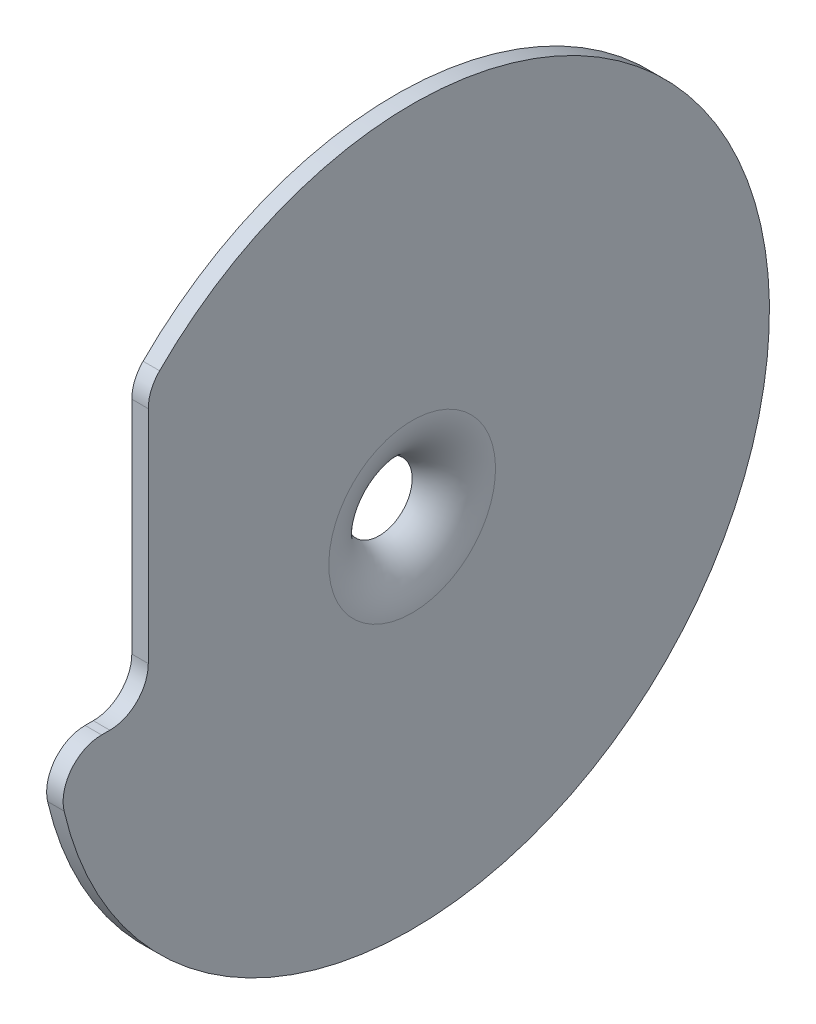
ISO-10303-21;
HEADER;
FILE_DESCRIPTION(('STEP AP214'),'2;1');
FILE_NAME('part.step','',(''),(''),'','','');
FILE_SCHEMA(('AUTOMOTIVE_DESIGN { 1 0 10303 214 1 1 1 1 }'));
ENDSEC;
DATA;
#1=APPLICATION_CONTEXT('core data for automotive mechanical design processes');
#2=APPLICATION_PROTOCOL_DEFINITION('international standard','automotive_design',2000,#1);
#3=PRODUCT_CONTEXT('',#1,'mechanical');
#4=PRODUCT('Part','Part','',(#3));
#5=PRODUCT_RELATED_PRODUCT_CATEGORY('part','',(#4));
#6=PRODUCT_DEFINITION_FORMATION('','',#4);
#7=PRODUCT_DEFINITION_CONTEXT('part definition',#1,'design');
#8=PRODUCT_DEFINITION('design','',#6,#7);
#9=PRODUCT_DEFINITION_SHAPE('','',#8);
#10=(LENGTH_UNIT() NAMED_UNIT(*) SI_UNIT(.MILLI.,.METRE.));
#11=(NAMED_UNIT(*) PLANE_ANGLE_UNIT() SI_UNIT($,.RADIAN.));
#12=(NAMED_UNIT(*) SI_UNIT($,.STERADIAN.) SOLID_ANGLE_UNIT());
#13=UNCERTAINTY_MEASURE_WITH_UNIT(LENGTH_MEASURE(1.E-05),#10,'distance_accuracy_value','');
#14=(GEOMETRIC_REPRESENTATION_CONTEXT(3) GLOBAL_UNCERTAINTY_ASSIGNED_CONTEXT((#13)) GLOBAL_UNIT_ASSIGNED_CONTEXT((#10,
#11,#12)) REPRESENTATION_CONTEXT('',''));
#15=CARTESIAN_POINT('',(0.,0.,0.));
#16=DIRECTION('',(0.,0.,1.));
#17=DIRECTION('',(1.,0.,0.));
#18=AXIS2_PLACEMENT_3D('',#15,#16,#17);
#19=CARTESIAN_POINT('',(-22.,0.,-2.));
#20=DIRECTION('',(0.,0.,1.));
#21=DIRECTION('',(0.,-1.,0.));
#22=AXIS2_PLACEMENT_3D('',#19,#20,#21);
#23=PLANE('',#22);
#24=DIRECTION('',(0.,-1.,0.));
#25=VECTOR('',#24,1.);
#26=CARTESIAN_POINT('',(-19.,0.,-2.));
#27=LINE('',#26,#25);
#28=CARTESIAN_POINT('',(-19.,22.6516557208048,-2.));
#29=VERTEX_POINT('',#28);
#30=CARTESIAN_POINT('',(-19.,-17.5,-2.));
#31=VERTEX_POINT('',#30);
#32=EDGE_CURVE('E115',#29,#31,#27,.T.);
#33=ORIENTED_EDGE('',*,*,#32,.F.);
#34=DIRECTION('',(-1.,0.,0.));
#35=VECTOR('',#34,1.);
#36=CARTESIAN_POINT('',(-22.,22.6516557208048,-2.));
#37=LINE('',#36,#35);
#38=CARTESIAN_POINT('',(-22.,22.6516557208048,-2.));
#39=VERTEX_POINT('',#38);
#40=EDGE_CURVE('E95',#29,#39,#37,.T.);
#41=ORIENTED_EDGE('',*,*,#40,.T.);
#42=DIRECTION('',(0.,-1.,0.));
#43=VECTOR('',#42,1.);
#44=CARTESIAN_POINT('',(-22.,0.,-2.));
#45=LINE('',#44,#43);
#46=CARTESIAN_POINT('',(-22.,-17.5,-2.));
#47=VERTEX_POINT('',#46);
#48=EDGE_CURVE('E117',#39,#47,#45,.T.);
#49=ORIENTED_EDGE('',*,*,#48,.T.);
#50=DIRECTION('',(1.,0.,0.));
#51=VECTOR('',#50,1.);
#52=CARTESIAN_POINT('',(-19.,-17.5,-2.));
#53=LINE('',#52,#51);
#54=EDGE_CURVE('E100',#47,#31,#53,.T.);
#55=ORIENTED_EDGE('',*,*,#54,.T.);
#56=EDGE_LOOP('',(#33,#41,#49,#55));
#57=FACE_BOUND('',#56,.T.);
#58=ADVANCED_FACE('F35',(#57),#23,.T.);
#59=CARTESIAN_POINT('',(-22.,-18.3727272727272,-50.));
#60=DIRECTION('',(1.,0.,0.));
#61=DIRECTION('',(0.,1.,0.));
#62=AXIS2_PLACEMENT_3D('',#59,#60,#61);
#63=CYLINDRICAL_SURFACE('',#62,65.);
#64=CARTESIAN_POINT('',(-22.,-18.3727272727272,-50.));
#65=DIRECTION('',(-1.,0.,0.));
#66=DIRECTION('',(0.,-1.,0.));
#67=AXIS2_PLACEMENT_3D('',#64,#65,#66);
#68=CIRCLE('',#67,65.);
#69=CARTESIAN_POINT('',(-22.,27.6028743579553,-4.05172413793104));
#70=VERTEX_POINT('',#69);
#71=CARTESIAN_POINT('',(-22.,-33.0843260188088,13.3132597670843));
#72=VERTEX_POINT('',#71);
#73=EDGE_CURVE('E109',#70,#72,#68,.T.);
#74=ORIENTED_EDGE('',*,*,#73,.F.);
#75=DIRECTION('',(1.,0.,0.));
#76=VECTOR('',#75,1.);
#77=CARTESIAN_POINT('',(-22.,27.6028743579553,-4.05172413793104));
#78=LINE('',#77,#76);
#79=CARTESIAN_POINT('',(-19.,27.6028743579553,-4.05172413793104));
#80=VERTEX_POINT('',#79);
#81=EDGE_CURVE('E94',#70,#80,#78,.T.);
#82=ORIENTED_EDGE('',*,*,#81,.T.);
#83=CARTESIAN_POINT('',(-19.,-18.3727272727272,-50.));
#84=DIRECTION('',(-1.,0.,0.));
#85=DIRECTION('',(0.,-1.,0.));
#86=AXIS2_PLACEMENT_3D('',#83,#84,#85);
#87=CIRCLE('',#86,65.);
#88=CARTESIAN_POINT('',(-19.,-33.0843260188088,13.3132597670843));
#89=VERTEX_POINT('',#88);
#90=EDGE_CURVE('E107',#80,#89,#87,.T.);
#91=ORIENTED_EDGE('',*,*,#90,.T.);
#92=DIRECTION('',(1.,0.,0.));
#93=VECTOR('',#92,1.);
#94=CARTESIAN_POINT('',(-22.,-33.0843260188088,13.3132597670843));
#95=LINE('',#94,#93);
#96=EDGE_CURVE('E110',#89,#72,#95,.F.);
#97=ORIENTED_EDGE('',*,*,#96,.T.);
#98=EDGE_LOOP('',(#74,#82,#91,#97));
#99=FACE_BOUND('',#98,.T.);
#100=ADVANCED_FACE('F106',(#99),#63,.T.);
#101=CARTESIAN_POINT('',(-22.,-24.5,0.));
#102=DIRECTION('',(0.,1.,0.));
#103=DIRECTION('',(-1.,0.,0.));
#104=AXIS2_PLACEMENT_3D('',#101,#102,#103);
#105=PLANE('',#104);
#106=DIRECTION('',(0.,0.,1.));
#107=VECTOR('',#106,1.);
#108=CARTESIAN_POINT('',(-22.,-24.5,0.));
#109=LINE('',#108,#107);
#110=CARTESIAN_POINT('',(-22.,-24.5,5.));
#111=VERTEX_POINT('',#110);
#112=CARTESIAN_POINT('',(-22.,-24.5,6.49490871524444));
#113=VERTEX_POINT('',#112);
#114=EDGE_CURVE('E123',#111,#113,#109,.T.);
#115=ORIENTED_EDGE('',*,*,#114,.T.);
#116=DIRECTION('',(-1.,0.,0.));
#117=VECTOR('',#116,1.);
#118=CARTESIAN_POINT('',(-19.,-24.5,6.49490871524444));
#119=LINE('',#118,#117);
#120=CARTESIAN_POINT('',(-19.,-24.5,6.49490871524444));
#121=VERTEX_POINT('',#120);
#122=EDGE_CURVE('E133',#113,#121,#119,.F.);
#123=ORIENTED_EDGE('',*,*,#122,.T.);
#124=DIRECTION('',(0.,0.,1.));
#125=VECTOR('',#124,1.);
#126=CARTESIAN_POINT('',(-19.,-24.5,0.));
#127=LINE('',#126,#125);
#128=CARTESIAN_POINT('',(-19.,-24.5,5.));
#129=VERTEX_POINT('',#128);
#130=EDGE_CURVE('E114',#129,#121,#127,.T.);
#131=ORIENTED_EDGE('',*,*,#130,.F.);
#132=DIRECTION('',(1.,0.,0.));
#133=VECTOR('',#132,1.);
#134=CARTESIAN_POINT('',(-22.,-24.5,5.));
#135=LINE('',#134,#133);
#136=EDGE_CURVE('E57',#129,#111,#135,.F.);
#137=ORIENTED_EDGE('',*,*,#136,.T.);
#138=EDGE_LOOP('',(#115,#123,#131,#137));
#139=FACE_BOUND('',#138,.T.);
#140=ADVANCED_FACE('F150',(#139),#105,.T.);
#141=CARTESIAN_POINT('',(-22.,0.,0.));
#142=DIRECTION('',(-1.,0.,0.));
#143=DIRECTION('',(0.,-1.,0.));
#144=AXIS2_PLACEMENT_3D('',#141,#142,#143);
#145=PLANE('',#144);
#146=CARTESIAN_POINT('',(-22.,-18.3727272727272,-50.));
#147=DIRECTION('',(-1.,0.,0.));
#148=DIRECTION('',(0.,-1.,0.));
#149=AXIS2_PLACEMENT_3D('',#146,#147,#148);
#150=CIRCLE('',#149,31.5);
#151=CARTESIAN_POINT('',(-22.,-49.8727272727272,-50.));
#152=VERTEX_POINT('',#151);
#153=EDGE_CURVE('E43',#152,#152,#150,.T.);
#154=ORIENTED_EDGE('',*,*,#153,.F.);
#155=EDGE_LOOP('',(#154));
#156=FACE_BOUND('',#155,.T.);
#157=ORIENTED_EDGE('',*,*,#48,.F.);
#158=CARTESIAN_POINT('',(-22.,22.6516557208048,-9.));
#159=DIRECTION('',(-1.,0.,0.));
#160=DIRECTION('',(0.,-1.,0.));
#161=AXIS2_PLACEMENT_3D('',#158,#159,#160);
#162=CIRCLE('',#161,7.);
#163=EDGE_CURVE('E130',#39,#70,#162,.T.);
#164=ORIENTED_EDGE('',*,*,#163,.T.);
#165=ORIENTED_EDGE('',*,*,#73,.T.);
#166=CARTESIAN_POINT('',(-22.,-31.5,6.49490871524444));
#167=DIRECTION('',(-1.,0.,0.));
#168=DIRECTION('',(0.,-1.,0.));
#169=AXIS2_PLACEMENT_3D('',#166,#167,#168);
#170=CIRCLE('',#169,7.);
#171=EDGE_CURVE('E50',#72,#113,#170,.T.);
#172=ORIENTED_EDGE('',*,*,#171,.T.);
#173=ORIENTED_EDGE('',*,*,#114,.F.);
#174=CARTESIAN_POINT('',(-22.,-17.5,5.));
#175=DIRECTION('',(-1.,0.,0.));
#176=DIRECTION('',(0.,-1.,0.));
#177=AXIS2_PLACEMENT_3D('',#174,#175,#176);
#178=CIRCLE('',#177,7.);
#179=EDGE_CURVE('E137',#111,#47,#178,.F.);
#180=ORIENTED_EDGE('',*,*,#179,.T.);
#181=EDGE_LOOP('',(#157,#164,#165,#172,#173,#180));
#182=FACE_BOUND('',#181,.T.);
#183=ADVANCED_FACE('F153',(#156,#182),#145,.T.);
#184=CARTESIAN_POINT('',(-19.,0.,0.));
#185=DIRECTION('',(-1.,0.,0.));
#186=DIRECTION('',(0.,-1.,0.));
#187=AXIS2_PLACEMENT_3D('',#184,#185,#186);
#188=PLANE('',#187);
#189=CARTESIAN_POINT('',(-19.,-18.3727272727272,-50.));
#190=DIRECTION('',(-1.,0.,0.));
#191=DIRECTION('',(0.,-1.,0.));
#192=AXIS2_PLACEMENT_3D('',#189,#190,#191);
#193=CIRCLE('',#192,15.1651513899117);
#194=CARTESIAN_POINT('',(-19.,-33.5378786626389,-50.));
#195=VERTEX_POINT('',#194);
#196=EDGE_CURVE('E11',#195,#195,#193,.T.);
#197=ORIENTED_EDGE('',*,*,#196,.T.);
#198=EDGE_LOOP('',(#197));
#199=FACE_BOUND('',#198,.T.);
#200=ORIENTED_EDGE('',*,*,#90,.F.);
#201=CARTESIAN_POINT('',(-19.,22.6516557208048,-9.));
#202=DIRECTION('',(-1.,0.,0.));
#203=DIRECTION('',(0.,-1.,0.));
#204=AXIS2_PLACEMENT_3D('',#201,#202,#203);
#205=CIRCLE('',#204,7.);
#206=EDGE_CURVE('E90',#80,#29,#205,.F.);
#207=ORIENTED_EDGE('',*,*,#206,.T.);
#208=ORIENTED_EDGE('',*,*,#32,.T.);
#209=CARTESIAN_POINT('',(-19.,-17.5,5.));
#210=DIRECTION('',(-1.,0.,0.));
#211=DIRECTION('',(0.,-1.,0.));
#212=AXIS2_PLACEMENT_3D('',#209,#210,#211);
#213=CIRCLE('',#212,7.);
#214=EDGE_CURVE('E136',#31,#129,#213,.T.);
#215=ORIENTED_EDGE('',*,*,#214,.T.);
#216=ORIENTED_EDGE('',*,*,#130,.T.);
#217=CARTESIAN_POINT('',(-19.,-31.5,6.49490871524444));
#218=DIRECTION('',(-1.,0.,0.));
#219=DIRECTION('',(0.,-1.,0.));
#220=AXIS2_PLACEMENT_3D('',#217,#218,#219);
#221=CIRCLE('',#220,7.);
#222=EDGE_CURVE('E101',#121,#89,#221,.F.);
#223=ORIENTED_EDGE('',*,*,#222,.T.);
#224=EDGE_LOOP('',(#200,#207,#208,#215,#216,#223));
#225=FACE_BOUND('',#224,.T.);
#226=ADVANCED_FACE('F112',(#199,#225),#188,.F.);
#227=CARTESIAN_POINT('',(-22.,22.6516557208048,-9.));
#228=DIRECTION('',(1.,0.,0.));
#229=DIRECTION('',(0.,1.,0.));
#230=AXIS2_PLACEMENT_3D('',#227,#228,#229);
#231=CYLINDRICAL_SURFACE('',#230,7.);
#232=ORIENTED_EDGE('',*,*,#163,.F.);
#233=ORIENTED_EDGE('',*,*,#40,.F.);
#234=ORIENTED_EDGE('',*,*,#206,.F.);
#235=ORIENTED_EDGE('',*,*,#81,.F.);
#236=EDGE_LOOP('',(#232,#233,#234,#235));
#237=FACE_BOUND('',#236,.T.);
#238=ADVANCED_FACE('F93',(#237),#231,.T.);
#239=CARTESIAN_POINT('',(-22.,-31.5,6.49490871524444));
#240=DIRECTION('',(1.,0.,0.));
#241=DIRECTION('',(0.,1.,0.));
#242=AXIS2_PLACEMENT_3D('',#239,#240,#241);
#243=CYLINDRICAL_SURFACE('',#242,7.);
#244=ORIENTED_EDGE('',*,*,#171,.F.);
#245=ORIENTED_EDGE('',*,*,#96,.F.);
#246=ORIENTED_EDGE('',*,*,#222,.F.);
#247=ORIENTED_EDGE('',*,*,#122,.F.);
#248=EDGE_LOOP('',(#244,#245,#246,#247));
#249=FACE_BOUND('',#248,.T.);
#250=ADVANCED_FACE('F152',(#249),#243,.T.);
#251=CARTESIAN_POINT('',(-22.,-17.5,5.));
#252=DIRECTION('',(-1.,0.,0.));
#253=DIRECTION('',(0.,-1.,0.));
#254=AXIS2_PLACEMENT_3D('',#251,#252,#253);
#255=CYLINDRICAL_SURFACE('',#254,7.);
#256=ORIENTED_EDGE('',*,*,#179,.F.);
#257=ORIENTED_EDGE('',*,*,#136,.F.);
#258=ORIENTED_EDGE('',*,*,#214,.F.);
#259=ORIENTED_EDGE('',*,*,#54,.F.);
#260=EDGE_LOOP('',(#256,#257,#258,#259));
#261=FACE_BOUND('',#260,.T.);
#262=ADVANCED_FACE('F157',(#261),#255,.F.);
#263=CARTESIAN_POINT('',(-25.,-18.3727272727272,-50.));
#264=DIRECTION('',(1.,0.,0.));
#265=DIRECTION('',(0.,1.,0.));
#266=AXIS2_PLACEMENT_3D('',#263,#264,#265);
#267=CYLINDRICAL_SURFACE('',#266,31.5);
#268=CARTESIAN_POINT('',(-25.,-18.3727272727272,-50.));
#269=DIRECTION('',(-1.,0.,0.));
#270=DIRECTION('',(0.,-1.,0.));
#271=AXIS2_PLACEMENT_3D('',#268,#269,#270);
#272=CIRCLE('',#271,31.5);
#273=CARTESIAN_POINT('',(-25.,-49.8727272727272,-50.));
#274=VERTEX_POINT('',#273);
#275=EDGE_CURVE('E119',#274,#274,#272,.T.);
#276=ORIENTED_EDGE('',*,*,#275,.F.);
#277=EDGE_LOOP('',(#276));
#278=FACE_BOUND('',#277,.T.);
#279=ORIENTED_EDGE('',*,*,#153,.T.);
#280=EDGE_LOOP('',(#279));
#281=FACE_BOUND('',#280,.T.);
#282=ADVANCED_FACE('F159',(#278,#281),#267,.T.);
#283=CARTESIAN_POINT('',(-25.,-18.3727272727272,-50.));
#284=DIRECTION('',(-1.,0.,0.));
#285=DIRECTION('',(0.,-1.,0.));
#286=AXIS2_PLACEMENT_3D('',#283,#284,#285);
#287=PLANE('',#286);
#288=CARTESIAN_POINT('',(-25.,-18.3727272727272,-50.));
#289=DIRECTION('',(-1.,0.,0.));
#290=DIRECTION('',(0.,-1.,0.));
#291=AXIS2_PLACEMENT_3D('',#288,#289,#290);
#292=CIRCLE('',#291,6.);
#293=CARTESIAN_POINT('',(-25.,-24.3727272727272,-50.));
#294=VERTEX_POINT('',#293);
#295=EDGE_CURVE('E236',#294,#294,#292,.T.);
#296=ORIENTED_EDGE('',*,*,#295,.F.);
#297=EDGE_LOOP('',(#296));
#298=FACE_BOUND('',#297,.T.);
#299=ORIENTED_EDGE('',*,*,#275,.T.);
#300=EDGE_LOOP('',(#299));
#301=FACE_BOUND('',#300,.T.);
#302=ADVANCED_FACE('F164',(#298,#301),#287,.T.);
#303=CARTESIAN_POINT('',(-29.,-18.3727272727272,-50.));
#304=DIRECTION('',(-1.,0.,0.));
#305=DIRECTION('',(0.,-1.,0.));
#306=AXIS2_PLACEMENT_3D('',#303,#304,#305);
#307=TOROIDAL_SURFACE('',#306,15.1651513899117,10.);
#308=ORIENTED_EDGE('',*,*,#295,.T.);
#309=EDGE_LOOP('',(#308));
#310=FACE_BOUND('',#309,.T.);
#311=ORIENTED_EDGE('',*,*,#196,.F.);
#312=EDGE_LOOP('',(#311));
#313=FACE_BOUND('',#312,.T.);
#314=ADVANCED_FACE('F37',(#310,#313),#307,.T.);
#315=CLOSED_SHELL('',(#58,#100,#140,#183,#226,#238,#250,#262,#282,#302,#314));
#316=MANIFOLD_SOLID_BREP('B2',#315);
#317=ADVANCED_BREP_SHAPE_REPRESENTATION('',(#18,#316),#14);
#318=SHAPE_DEFINITION_REPRESENTATION(#9,#317);
ENDSEC;
END-ISO-10303-21;
